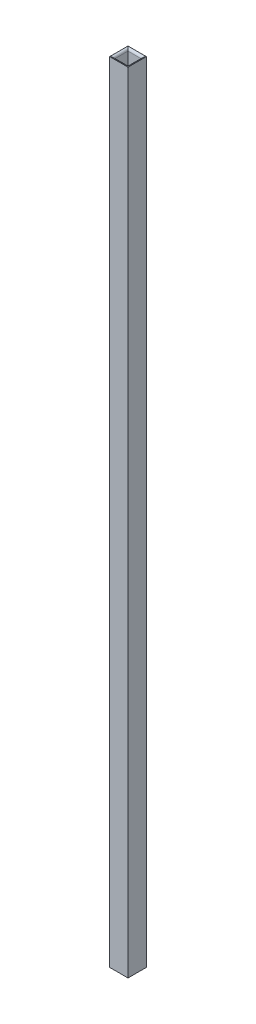
ISO-10303-21;
HEADER;
FILE_DESCRIPTION(('STEP AP214'),'2;1');
FILE_NAME('part.step','',(''),(''),'','','');
FILE_SCHEMA(('AUTOMOTIVE_DESIGN { 1 0 10303 214 1 1 1 1 }'));
ENDSEC;
DATA;
#1=APPLICATION_CONTEXT('core data for automotive mechanical design processes');
#2=APPLICATION_PROTOCOL_DEFINITION('international standard','automotive_design',2000,#1);
#3=PRODUCT_CONTEXT('',#1,'mechanical');
#4=PRODUCT('Part','Part','',(#3));
#5=PRODUCT_RELATED_PRODUCT_CATEGORY('part','',(#4));
#6=PRODUCT_DEFINITION_FORMATION('','',#4);
#7=PRODUCT_DEFINITION_CONTEXT('part definition',#1,'design');
#8=PRODUCT_DEFINITION('design','',#6,#7);
#9=PRODUCT_DEFINITION_SHAPE('','',#8);
#10=(LENGTH_UNIT() NAMED_UNIT(*) SI_UNIT(.MILLI.,.METRE.));
#11=(NAMED_UNIT(*) PLANE_ANGLE_UNIT() SI_UNIT($,.RADIAN.));
#12=(NAMED_UNIT(*) SI_UNIT($,.STERADIAN.) SOLID_ANGLE_UNIT());
#13=UNCERTAINTY_MEASURE_WITH_UNIT(LENGTH_MEASURE(1.E-05),#10,'distance_accuracy_value','');
#14=(GEOMETRIC_REPRESENTATION_CONTEXT(3) GLOBAL_UNCERTAINTY_ASSIGNED_CONTEXT((#13)) GLOBAL_UNIT_ASSIGNED_CONTEXT((#10,
#11,#12)) REPRESENTATION_CONTEXT('',''));
#15=CARTESIAN_POINT('',(0.,0.,0.));
#16=DIRECTION('',(0.,0.,1.));
#17=DIRECTION('',(1.,0.,0.));
#18=AXIS2_PLACEMENT_3D('',#15,#16,#17);
#19=CARTESIAN_POINT('',(-15.5448,557.276,-16.7767));
#20=DIRECTION('',(-1.,0.,0.));
#21=DIRECTION('',(0.,0.,1.));
#22=AXIS2_PLACEMENT_3D('',#19,#20,#21);
#23=CYLINDRICAL_SURFACE('',#22,1.524);
#24=CARTESIAN_POINT('',(-15.4813,557.276,-16.7767));
#25=DIRECTION('',(-0.707106781186547,0.,0.707106781186547));
#26=DIRECTION('',(-0.707106781186547,0.,-0.707106781186547));
#27=AXIS2_PLACEMENT_3D('',#24,#25,#26);
#28=ELLIPSE('',#27,2.1552614690566,1.524);
#29=CARTESIAN_POINT('',(-13.9573,557.276,-15.2527));
#30=VERTEX_POINT('',#29);
#31=CARTESIAN_POINT('',(-15.4813,558.8,-16.7767));
#32=VERTEX_POINT('',#31);
#33=EDGE_CURVE('E11',#30,#32,#28,.T.);
#34=ORIENTED_EDGE('',*,*,#33,.F.);
#35=DIRECTION('',(-1.,0.,0.));
#36=VECTOR('',#35,1.);
#37=CARTESIAN_POINT('',(-15.5448,557.276,-15.2527));
#38=LINE('',#37,#36);
#39=CARTESIAN_POINT('',(-4.13230000000001,557.276,-15.2527));
#40=VERTEX_POINT('',#39);
#41=EDGE_CURVE('E239',#40,#30,#38,.T.);
#42=ORIENTED_EDGE('',*,*,#41,.F.);
#43=CARTESIAN_POINT('',(-2.60830000000001,557.276,-16.7767));
#44=DIRECTION('',(-0.707106781186547,0.,-0.707106781186547));
#45=DIRECTION('',(0.707106781186547,0.,-0.707106781186547));
#46=AXIS2_PLACEMENT_3D('',#43,#44,#45);
#47=ELLIPSE('',#46,2.1552614690566,1.524);
#48=CARTESIAN_POINT('',(-2.60830000000001,558.8,-16.7767));
#49=VERTEX_POINT('',#48);
#50=EDGE_CURVE('E53',#40,#49,#47,.T.);
#51=ORIENTED_EDGE('',*,*,#50,.T.);
#52=DIRECTION('',(-1.,0.,0.));
#53=VECTOR('',#52,1.);
#54=CARTESIAN_POINT('',(0.,558.8,-16.7767));
#55=LINE('',#54,#53);
#56=EDGE_CURVE('E215',#32,#49,#55,.F.);
#57=ORIENTED_EDGE('',*,*,#56,.F.);
#58=EDGE_LOOP('',(#34,#42,#51,#57));
#59=FACE_BOUND('',#58,.T.);
#60=ADVANCED_FACE('F45',(#59),#23,.T.);
#61=CARTESIAN_POINT('',(-2.60830000000001,557.276,-16.8402));
#62=DIRECTION('',(0.,0.,-1.));
#63=DIRECTION('',(-1.,0.,0.));
#64=AXIS2_PLACEMENT_3D('',#61,#62,#63);
#65=CYLINDRICAL_SURFACE('',#64,1.524);
#66=ORIENTED_EDGE('',*,*,#50,.F.);
#67=DIRECTION('',(0.,0.,-1.));
#68=VECTOR('',#67,1.);
#69=CARTESIAN_POINT('',(-4.13230000000001,557.276,-16.8402));
#70=LINE('',#69,#68);
#71=CARTESIAN_POINT('',(-4.13230000000001,557.276,-5.42770000000001));
#72=VERTEX_POINT('',#71);
#73=EDGE_CURVE('E235',#72,#40,#70,.T.);
#74=ORIENTED_EDGE('',*,*,#73,.F.);
#75=CARTESIAN_POINT('',(-2.60830000000001,557.276,-3.90370000000001));
#76=DIRECTION('',(0.707106781186547,0.,-0.707106781186548));
#77=DIRECTION('',(0.707106781186548,0.,0.707106781186547));
#78=AXIS2_PLACEMENT_3D('',#75,#76,#77);
#79=ELLIPSE('',#78,2.1552614690566,1.524);
#80=CARTESIAN_POINT('',(-2.60830000000001,558.8,-3.90370000000001));
#81=VERTEX_POINT('',#80);
#82=EDGE_CURVE('E67',#72,#81,#79,.T.);
#83=ORIENTED_EDGE('',*,*,#82,.T.);
#84=DIRECTION('',(0.,0.,-1.));
#85=VECTOR('',#84,1.);
#86=CARTESIAN_POINT('',(-2.60830000000001,558.8,0.));
#87=LINE('',#86,#85);
#88=EDGE_CURVE('E219',#49,#81,#87,.F.);
#89=ORIENTED_EDGE('',*,*,#88,.F.);
#90=EDGE_LOOP('',(#66,#74,#83,#89));
#91=FACE_BOUND('',#90,.T.);
#92=ADVANCED_FACE('F250',(#91),#65,.T.);
#93=CARTESIAN_POINT('',(-15.5448,557.276,-3.90370000000001));
#94=DIRECTION('',(1.,0.,0.));
#95=DIRECTION('',(0.,0.,-1.));
#96=AXIS2_PLACEMENT_3D('',#93,#94,#95);
#97=CYLINDRICAL_SURFACE('',#96,1.524);
#98=ORIENTED_EDGE('',*,*,#82,.F.);
#99=DIRECTION('',(1.,0.,0.));
#100=VECTOR('',#99,1.);
#101=CARTESIAN_POINT('',(-15.5448,557.276,-5.42770000000001));
#102=LINE('',#101,#100);
#103=CARTESIAN_POINT('',(-13.9573,557.276,-5.42770000000001));
#104=VERTEX_POINT('',#103);
#105=EDGE_CURVE('E231',#104,#72,#102,.T.);
#106=ORIENTED_EDGE('',*,*,#105,.F.);
#107=CARTESIAN_POINT('',(-15.4813,557.276,-3.90370000000001));
#108=DIRECTION('',(0.707106781186548,0.,0.707106781186547));
#109=DIRECTION('',(-0.707106781186547,0.,0.707106781186548));
#110=AXIS2_PLACEMENT_3D('',#107,#108,#109);
#111=ELLIPSE('',#110,2.1552614690566,1.524);
#112=CARTESIAN_POINT('',(-15.4813,558.8,-3.90370000000001));
#113=VERTEX_POINT('',#112);
#114=EDGE_CURVE('E243',#104,#113,#111,.T.);
#115=ORIENTED_EDGE('',*,*,#114,.T.);
#116=DIRECTION('',(1.,0.,0.));
#117=VECTOR('',#116,1.);
#118=CARTESIAN_POINT('',(0.,558.8,-3.90370000000001));
#119=LINE('',#118,#117);
#120=EDGE_CURVE('E223',#81,#113,#119,.F.);
#121=ORIENTED_EDGE('',*,*,#120,.F.);
#122=EDGE_LOOP('',(#98,#106,#115,#121));
#123=FACE_BOUND('',#122,.T.);
#124=ADVANCED_FACE('F315',(#123),#97,.T.);
#125=CARTESIAN_POINT('',(-15.4813,557.276,-16.8402));
#126=DIRECTION('',(0.,0.,1.));
#127=DIRECTION('',(1.,0.,0.));
#128=AXIS2_PLACEMENT_3D('',#125,#126,#127);
#129=CYLINDRICAL_SURFACE('',#128,1.524);
#130=DIRECTION('',(0.,0.,1.));
#131=VECTOR('',#130,1.);
#132=CARTESIAN_POINT('',(-13.9573,557.276,-16.8402));
#133=LINE('',#132,#131);
#134=EDGE_CURVE('E211',#30,#104,#133,.T.);
#135=ORIENTED_EDGE('',*,*,#134,.F.);
#136=ORIENTED_EDGE('',*,*,#33,.T.);
#137=DIRECTION('',(0.,0.,1.));
#138=VECTOR('',#137,1.);
#139=CARTESIAN_POINT('',(-15.4813,558.8,0.));
#140=LINE('',#139,#138);
#141=EDGE_CURVE('E227',#113,#32,#140,.F.);
#142=ORIENTED_EDGE('',*,*,#141,.F.);
#143=ORIENTED_EDGE('',*,*,#114,.F.);
#144=EDGE_LOOP('',(#135,#136,#142,#143));
#145=FACE_BOUND('',#144,.T.);
#146=ADVANCED_FACE('F255',(#145),#129,.T.);
#147=CARTESIAN_POINT('',(-15.5448,1.52399999999997,-3.90370000000001));
#148=DIRECTION('',(1.,0.,0.));
#149=DIRECTION('',(0.,0.,-1.));
#150=AXIS2_PLACEMENT_3D('',#147,#148,#149);
#151=CYLINDRICAL_SURFACE('',#150,1.524);
#152=CARTESIAN_POINT('',(-15.4813,1.52399999999997,-3.90370000000001));
#153=DIRECTION('',(0.707106781186548,0.,0.707106781186547));
#154=DIRECTION('',(0.707106781186547,0.,-0.707106781186548));
#155=AXIS2_PLACEMENT_3D('',#152,#153,#154);
#156=ELLIPSE('',#155,2.1552614690566,1.524);
#157=CARTESIAN_POINT('',(-13.9573,1.52400000000008,-5.42770000000001));
#158=VERTEX_POINT('',#157);
#159=CARTESIAN_POINT('',(-15.4813,0.,-3.90370000000001));
#160=VERTEX_POINT('',#159);
#161=EDGE_CURVE('E208',#158,#160,#156,.F.);
#162=ORIENTED_EDGE('',*,*,#161,.F.);
#163=DIRECTION('',(-1.,0.,0.));
#164=VECTOR('',#163,1.);
#165=CARTESIAN_POINT('',(-15.5448,1.52399999999997,-5.42770000000001));
#166=LINE('',#165,#164);
#167=CARTESIAN_POINT('',(-4.13230000000001,1.52400000000008,-5.42770000000001));
#168=VERTEX_POINT('',#167);
#169=EDGE_CURVE('E195',#168,#158,#166,.T.);
#170=ORIENTED_EDGE('',*,*,#169,.F.);
#171=CARTESIAN_POINT('',(-2.60830000000001,1.52399999999997,-3.90370000000001));
#172=DIRECTION('',(0.707106781186547,0.,-0.707106781186548));
#173=DIRECTION('',(-0.707106781186548,0.,-0.707106781186547));
#174=AXIS2_PLACEMENT_3D('',#171,#172,#173);
#175=ELLIPSE('',#174,2.1552614690566,1.524);
#176=CARTESIAN_POINT('',(-2.60830000000001,0.,-3.90370000000001));
#177=VERTEX_POINT('',#176);
#178=EDGE_CURVE('E205',#168,#177,#175,.F.);
#179=ORIENTED_EDGE('',*,*,#178,.T.);
#180=DIRECTION('',(-1.,0.,0.));
#181=VECTOR('',#180,1.);
#182=CARTESIAN_POINT('',(-15.5448,0.,-3.90370000000001));
#183=LINE('',#182,#181);
#184=EDGE_CURVE('E166',#160,#177,#183,.F.);
#185=ORIENTED_EDGE('',*,*,#184,.F.);
#186=EDGE_LOOP('',(#162,#170,#179,#185));
#187=FACE_BOUND('',#186,.T.);
#188=ADVANCED_FACE('F323',(#187),#151,.T.);
#189=CARTESIAN_POINT('',(-2.60830000000001,1.52399999999997,-16.8402));
#190=DIRECTION('',(0.,0.,-1.));
#191=DIRECTION('',(-1.,0.,0.));
#192=AXIS2_PLACEMENT_3D('',#189,#190,#191);
#193=CYLINDRICAL_SURFACE('',#192,1.524);
#194=ORIENTED_EDGE('',*,*,#178,.F.);
#195=DIRECTION('',(0.,0.,1.));
#196=VECTOR('',#195,1.);
#197=CARTESIAN_POINT('',(-4.13230000000001,1.52399999999997,-16.8402));
#198=LINE('',#197,#196);
#199=CARTESIAN_POINT('',(-4.13230000000001,1.52400000000008,-15.2527));
#200=VERTEX_POINT('',#199);
#201=EDGE_CURVE('E191',#200,#168,#198,.T.);
#202=ORIENTED_EDGE('',*,*,#201,.F.);
#203=CARTESIAN_POINT('',(-2.60830000000001,1.52399999999997,-16.7767));
#204=DIRECTION('',(-0.707106781186547,0.,-0.707106781186547));
#205=DIRECTION('',(-0.707106781186547,0.,0.707106781186547));
#206=AXIS2_PLACEMENT_3D('',#203,#204,#205);
#207=ELLIPSE('',#206,2.1552614690566,1.524);
#208=CARTESIAN_POINT('',(-2.60830000000001,0.,-16.7767));
#209=VERTEX_POINT('',#208);
#210=EDGE_CURVE('E202',#200,#209,#207,.F.);
#211=ORIENTED_EDGE('',*,*,#210,.T.);
#212=DIRECTION('',(0.,0.,1.));
#213=VECTOR('',#212,1.);
#214=CARTESIAN_POINT('',(-2.60830000000001,0.,-16.8402));
#215=LINE('',#214,#213);
#216=EDGE_CURVE('E175',#177,#209,#215,.F.);
#217=ORIENTED_EDGE('',*,*,#216,.F.);
#218=EDGE_LOOP('',(#194,#202,#211,#217));
#219=FACE_BOUND('',#218,.T.);
#220=ADVANCED_FACE('F326',(#219),#193,.T.);
#221=CARTESIAN_POINT('',(-15.5448,1.52399999999997,-16.7767));
#222=DIRECTION('',(-1.,0.,0.));
#223=DIRECTION('',(0.,0.,1.));
#224=AXIS2_PLACEMENT_3D('',#221,#222,#223);
#225=CYLINDRICAL_SURFACE('',#224,1.524);
#226=ORIENTED_EDGE('',*,*,#210,.F.);
#227=DIRECTION('',(1.,0.,0.));
#228=VECTOR('',#227,1.);
#229=CARTESIAN_POINT('',(-15.5448,1.52399999999997,-15.2527));
#230=LINE('',#229,#228);
#231=CARTESIAN_POINT('',(-13.9573,1.52400000000008,-15.2527));
#232=VERTEX_POINT('',#231);
#233=EDGE_CURVE('E187',#232,#200,#230,.T.);
#234=ORIENTED_EDGE('',*,*,#233,.F.);
#235=CARTESIAN_POINT('',(-15.4813,1.52399999999997,-16.7767));
#236=DIRECTION('',(-0.707106781186547,0.,0.707106781186547));
#237=DIRECTION('',(0.707106781186547,0.,0.707106781186547));
#238=AXIS2_PLACEMENT_3D('',#235,#236,#237);
#239=ELLIPSE('',#238,2.1552614690566,1.524);
#240=CARTESIAN_POINT('',(-15.4813,0.,-16.7767));
#241=VERTEX_POINT('',#240);
#242=EDGE_CURVE('E199',#232,#241,#239,.F.);
#243=ORIENTED_EDGE('',*,*,#242,.T.);
#244=DIRECTION('',(1.,0.,0.));
#245=VECTOR('',#244,1.);
#246=CARTESIAN_POINT('',(-15.5448,0.,-16.7767));
#247=LINE('',#246,#245);
#248=EDGE_CURVE('E179',#209,#241,#247,.F.);
#249=ORIENTED_EDGE('',*,*,#248,.F.);
#250=EDGE_LOOP('',(#226,#234,#243,#249));
#251=FACE_BOUND('',#250,.T.);
#252=ADVANCED_FACE('F330',(#251),#225,.T.);
#253=CARTESIAN_POINT('',(-15.4813,1.52399999999997,-16.8402));
#254=DIRECTION('',(0.,0.,1.));
#255=DIRECTION('',(1.,0.,0.));
#256=AXIS2_PLACEMENT_3D('',#253,#254,#255);
#257=CYLINDRICAL_SURFACE('',#256,1.524);
#258=DIRECTION('',(0.,0.,-1.));
#259=VECTOR('',#258,1.);
#260=CARTESIAN_POINT('',(-13.9573,1.52399999999997,-16.8402));
#261=LINE('',#260,#259);
#262=EDGE_CURVE('E161',#158,#232,#261,.T.);
#263=ORIENTED_EDGE('',*,*,#262,.F.);
#264=ORIENTED_EDGE('',*,*,#161,.T.);
#265=DIRECTION('',(0.,0.,-1.));
#266=VECTOR('',#265,1.);
#267=CARTESIAN_POINT('',(-15.4813,0.,-16.8402));
#268=LINE('',#267,#266);
#269=EDGE_CURVE('E183',#241,#160,#268,.F.);
#270=ORIENTED_EDGE('',*,*,#269,.F.);
#271=ORIENTED_EDGE('',*,*,#242,.F.);
#272=EDGE_LOOP('',(#263,#264,#270,#271));
#273=FACE_BOUND('',#272,.T.);
#274=ADVANCED_FACE('F334',(#273),#257,.T.);
#275=CARTESIAN_POINT('',(-15.5448,558.8,-16.8402));
#276=DIRECTION('',(1.,0.,0.));
#277=DIRECTION('',(0.,0.,-1.));
#278=AXIS2_PLACEMENT_3D('',#275,#276,#277);
#279=PLANE('',#278);
#280=DIRECTION('',(0.,0.,1.));
#281=VECTOR('',#280,1.);
#282=CARTESIAN_POINT('',(-15.5448,0.,-16.8402));
#283=LINE('',#282,#281);
#284=CARTESIAN_POINT('',(-15.5448,0.,-16.8402));
#285=VERTEX_POINT('',#284);
#286=CARTESIAN_POINT('',(-15.5448,0.,-3.84020000000001));
#287=VERTEX_POINT('',#286);
#288=EDGE_CURVE('E159',#285,#287,#283,.T.);
#289=ORIENTED_EDGE('',*,*,#288,.T.);
#290=DIRECTION('',(0.,-1.,0.));
#291=VECTOR('',#290,1.);
#292=CARTESIAN_POINT('',(-15.5448,558.8,-3.84020000000001));
#293=LINE('',#292,#291);
#294=CARTESIAN_POINT('',(-15.5448,558.8,-3.84020000000001));
#295=VERTEX_POINT('',#294);
#296=EDGE_CURVE('E137',#295,#287,#293,.T.);
#297=ORIENTED_EDGE('',*,*,#296,.F.);
#298=DIRECTION('',(0.,0.,1.));
#299=VECTOR('',#298,1.);
#300=CARTESIAN_POINT('',(-15.5448,558.8,-16.8402));
#301=LINE('',#300,#299);
#302=CARTESIAN_POINT('',(-15.5448,558.8,-16.8402));
#303=VERTEX_POINT('',#302);
#304=EDGE_CURVE('E145',#303,#295,#301,.T.);
#305=ORIENTED_EDGE('',*,*,#304,.F.);
#306=DIRECTION('',(0.,-1.,0.));
#307=VECTOR('',#306,1.);
#308=CARTESIAN_POINT('',(-15.5448,558.8,-16.8402));
#309=LINE('',#308,#307);
#310=EDGE_CURVE('E279',#303,#285,#309,.T.);
#311=ORIENTED_EDGE('',*,*,#310,.T.);
#312=EDGE_LOOP('',(#289,#297,#305,#311));
#313=FACE_BOUND('',#312,.T.);
#314=ADVANCED_FACE('F157',(#313),#279,.F.);
#315=CARTESIAN_POINT('',(-15.5448,558.8,-3.84020000000001));
#316=DIRECTION('',(0.,0.,-1.));
#317=DIRECTION('',(-1.,0.,0.));
#318=AXIS2_PLACEMENT_3D('',#315,#316,#317);
#319=PLANE('',#318);
#320=DIRECTION('',(1.,0.,0.));
#321=VECTOR('',#320,1.);
#322=CARTESIAN_POINT('',(-15.5448,0.,-3.84020000000001));
#323=LINE('',#322,#321);
#324=CARTESIAN_POINT('',(-2.54480000000001,0.,-3.84020000000001));
#325=VERTEX_POINT('',#324);
#326=EDGE_CURVE('E282',#287,#325,#323,.T.);
#327=ORIENTED_EDGE('',*,*,#326,.T.);
#328=DIRECTION('',(0.,-1.,0.));
#329=VECTOR('',#328,1.);
#330=CARTESIAN_POINT('',(-2.54480000000001,558.8,-3.84020000000001));
#331=LINE('',#330,#329);
#332=CARTESIAN_POINT('',(-2.54480000000001,558.8,-3.84020000000001));
#333=VERTEX_POINT('',#332);
#334=EDGE_CURVE('E140',#333,#325,#331,.T.);
#335=ORIENTED_EDGE('',*,*,#334,.F.);
#336=DIRECTION('',(1.,0.,0.));
#337=VECTOR('',#336,1.);
#338=CARTESIAN_POINT('',(-15.5448,558.8,-3.84020000000001));
#339=LINE('',#338,#337);
#340=EDGE_CURVE('E133',#295,#333,#339,.T.);
#341=ORIENTED_EDGE('',*,*,#340,.F.);
#342=ORIENTED_EDGE('',*,*,#296,.T.);
#343=EDGE_LOOP('',(#327,#335,#341,#342));
#344=FACE_BOUND('',#343,.T.);
#345=ADVANCED_FACE('F135',(#344),#319,.F.);
#346=CARTESIAN_POINT('',(-2.54480000000001,558.8,-16.8402));
#347=DIRECTION('',(-1.,0.,0.));
#348=DIRECTION('',(0.,0.,1.));
#349=AXIS2_PLACEMENT_3D('',#346,#347,#348);
#350=PLANE('',#349);
#351=DIRECTION('',(0.,0.,-1.));
#352=VECTOR('',#351,1.);
#353=CARTESIAN_POINT('',(-2.54480000000001,0.,-16.8402));
#354=LINE('',#353,#352);
#355=CARTESIAN_POINT('',(-2.54480000000001,0.,-16.8402));
#356=VERTEX_POINT('',#355);
#357=EDGE_CURVE('E285',#325,#356,#354,.T.);
#358=ORIENTED_EDGE('',*,*,#357,.T.);
#359=DIRECTION('',(0.,-1.,0.));
#360=VECTOR('',#359,1.);
#361=CARTESIAN_POINT('',(-2.54480000000001,558.8,-16.8402));
#362=LINE('',#361,#360);
#363=CARTESIAN_POINT('',(-2.54480000000001,558.8,-16.8402));
#364=VERTEX_POINT('',#363);
#365=EDGE_CURVE('E168',#364,#356,#362,.T.);
#366=ORIENTED_EDGE('',*,*,#365,.F.);
#367=DIRECTION('',(0.,0.,-1.));
#368=VECTOR('',#367,1.);
#369=CARTESIAN_POINT('',(-2.54480000000001,558.8,-16.8402));
#370=LINE('',#369,#368);
#371=EDGE_CURVE('E144',#333,#364,#370,.T.);
#372=ORIENTED_EDGE('',*,*,#371,.F.);
#373=ORIENTED_EDGE('',*,*,#334,.T.);
#374=EDGE_LOOP('',(#358,#366,#372,#373));
#375=FACE_BOUND('',#374,.T.);
#376=ADVANCED_FACE('F301',(#375),#350,.F.);
#377=CARTESIAN_POINT('',(-15.5448,558.8,-16.8402));
#378=DIRECTION('',(0.,0.,1.));
#379=DIRECTION('',(1.,0.,0.));
#380=AXIS2_PLACEMENT_3D('',#377,#378,#379);
#381=PLANE('',#380);
#382=DIRECTION('',(-1.,0.,0.));
#383=VECTOR('',#382,1.);
#384=CARTESIAN_POINT('',(-15.5448,0.,-16.8402));
#385=LINE('',#384,#383);
#386=EDGE_CURVE('E155',#356,#285,#385,.T.);
#387=ORIENTED_EDGE('',*,*,#386,.T.);
#388=ORIENTED_EDGE('',*,*,#310,.F.);
#389=DIRECTION('',(-1.,0.,0.));
#390=VECTOR('',#389,1.);
#391=CARTESIAN_POINT('',(-15.5448,558.8,-16.8402));
#392=LINE('',#391,#390);
#393=EDGE_CURVE('E150',#364,#303,#392,.T.);
#394=ORIENTED_EDGE('',*,*,#393,.F.);
#395=ORIENTED_EDGE('',*,*,#365,.T.);
#396=EDGE_LOOP('',(#387,#388,#394,#395));
#397=FACE_BOUND('',#396,.T.);
#398=ADVANCED_FACE('F296',(#397),#381,.F.);
#399=CARTESIAN_POINT('',(0.,558.8,0.));
#400=DIRECTION('',(0.,1.,0.));
#401=DIRECTION('',(0.,0.,1.));
#402=AXIS2_PLACEMENT_3D('',#399,#400,#401);
#403=PLANE('',#402);
#404=ORIENTED_EDGE('',*,*,#120,.T.);
#405=ORIENTED_EDGE('',*,*,#141,.T.);
#406=ORIENTED_EDGE('',*,*,#56,.T.);
#407=ORIENTED_EDGE('',*,*,#88,.T.);
#408=EDGE_LOOP('',(#404,#405,#406,#407));
#409=FACE_BOUND('',#408,.T.);
#410=ORIENTED_EDGE('',*,*,#304,.T.);
#411=ORIENTED_EDGE('',*,*,#340,.T.);
#412=ORIENTED_EDGE('',*,*,#371,.T.);
#413=ORIENTED_EDGE('',*,*,#393,.T.);
#414=EDGE_LOOP('',(#410,#411,#412,#413));
#415=FACE_BOUND('',#414,.T.);
#416=ADVANCED_FACE('F148',(#409,#415),#403,.T.);
#417=CARTESIAN_POINT('',(0.,0.,0.));
#418=DIRECTION('',(0.,1.,0.));
#419=DIRECTION('',(0.,0.,1.));
#420=AXIS2_PLACEMENT_3D('',#417,#418,#419);
#421=PLANE('',#420);
#422=ORIENTED_EDGE('',*,*,#248,.T.);
#423=ORIENTED_EDGE('',*,*,#269,.T.);
#424=ORIENTED_EDGE('',*,*,#184,.T.);
#425=ORIENTED_EDGE('',*,*,#216,.T.);
#426=EDGE_LOOP('',(#422,#423,#424,#425));
#427=FACE_BOUND('',#426,.T.);
#428=ORIENTED_EDGE('',*,*,#288,.F.);
#429=ORIENTED_EDGE('',*,*,#386,.F.);
#430=ORIENTED_EDGE('',*,*,#357,.F.);
#431=ORIENTED_EDGE('',*,*,#326,.F.);
#432=EDGE_LOOP('',(#428,#429,#430,#431));
#433=FACE_BOUND('',#432,.T.);
#434=ADVANCED_FACE('F300',(#427,#433),#421,.F.);
#435=CARTESIAN_POINT('',(-13.9573,558.8,-16.8402));
#436=DIRECTION('',(1.,0.,0.));
#437=DIRECTION('',(0.,0.,-1.));
#438=AXIS2_PLACEMENT_3D('',#435,#436,#437);
#439=PLANE('',#438);
#440=DIRECTION('',(0.,-1.,0.));
#441=VECTOR('',#440,1.);
#442=CARTESIAN_POINT('',(-13.9573,558.8,-15.2527));
#443=LINE('',#442,#441);
#444=EDGE_CURVE('E260',#30,#232,#443,.T.);
#445=ORIENTED_EDGE('',*,*,#444,.F.);
#446=ORIENTED_EDGE('',*,*,#134,.T.);
#447=DIRECTION('',(0.,-1.,0.));
#448=VECTOR('',#447,1.);
#449=CARTESIAN_POINT('',(-13.9573,558.8,-5.42770000000001));
#450=LINE('',#449,#448);
#451=EDGE_CURVE('E271',#104,#158,#450,.T.);
#452=ORIENTED_EDGE('',*,*,#451,.T.);
#453=ORIENTED_EDGE('',*,*,#262,.T.);
#454=EDGE_LOOP('',(#445,#446,#452,#453));
#455=FACE_BOUND('',#454,.T.);
#456=ADVANCED_FACE('F375',(#455),#439,.T.);
#457=CARTESIAN_POINT('',(-15.5448,558.8,-5.42770000000001));
#458=DIRECTION('',(0.,0.,-1.));
#459=DIRECTION('',(-1.,0.,0.));
#460=AXIS2_PLACEMENT_3D('',#457,#458,#459);
#461=PLANE('',#460);
#462=ORIENTED_EDGE('',*,*,#451,.F.);
#463=ORIENTED_EDGE('',*,*,#105,.T.);
#464=DIRECTION('',(0.,-1.,0.));
#465=VECTOR('',#464,1.);
#466=CARTESIAN_POINT('',(-4.13230000000001,558.8,-5.42770000000001));
#467=LINE('',#466,#465);
#468=EDGE_CURVE('E267',#72,#168,#467,.T.);
#469=ORIENTED_EDGE('',*,*,#468,.T.);
#470=ORIENTED_EDGE('',*,*,#169,.T.);
#471=EDGE_LOOP('',(#462,#463,#469,#470));
#472=FACE_BOUND('',#471,.T.);
#473=ADVANCED_FACE('F384',(#472),#461,.T.);
#474=CARTESIAN_POINT('',(-4.13230000000001,558.8,-16.8402));
#475=DIRECTION('',(-1.,0.,0.));
#476=DIRECTION('',(0.,0.,1.));
#477=AXIS2_PLACEMENT_3D('',#474,#475,#476);
#478=PLANE('',#477);
#479=ORIENTED_EDGE('',*,*,#468,.F.);
#480=ORIENTED_EDGE('',*,*,#73,.T.);
#481=DIRECTION('',(0.,-1.,0.));
#482=VECTOR('',#481,1.);
#483=CARTESIAN_POINT('',(-4.13230000000001,558.8,-15.2527));
#484=LINE('',#483,#482);
#485=EDGE_CURVE('E262',#40,#200,#484,.T.);
#486=ORIENTED_EDGE('',*,*,#485,.T.);
#487=ORIENTED_EDGE('',*,*,#201,.T.);
#488=EDGE_LOOP('',(#479,#480,#486,#487));
#489=FACE_BOUND('',#488,.T.);
#490=ADVANCED_FACE('F394',(#489),#478,.T.);
#491=CARTESIAN_POINT('',(-15.5448,558.8,-15.2527));
#492=DIRECTION('',(0.,0.,1.));
#493=DIRECTION('',(1.,0.,0.));
#494=AXIS2_PLACEMENT_3D('',#491,#492,#493);
#495=PLANE('',#494);
#496=ORIENTED_EDGE('',*,*,#485,.F.);
#497=ORIENTED_EDGE('',*,*,#41,.T.);
#498=ORIENTED_EDGE('',*,*,#444,.T.);
#499=ORIENTED_EDGE('',*,*,#233,.T.);
#500=EDGE_LOOP('',(#496,#497,#498,#499));
#501=FACE_BOUND('',#500,.T.);
#502=ADVANCED_FACE('F259',(#501),#495,.T.);
#503=CLOSED_SHELL('',(#60,#92,#124,#146,#188,#220,#252,#274,#314,#345,#376,#398,#416,#434,#456,
#473,#490,#502));
#504=MANIFOLD_SOLID_BREP('B2',#503);
#505=ADVANCED_BREP_SHAPE_REPRESENTATION('',(#18,#504),#14);
#506=SHAPE_DEFINITION_REPRESENTATION(#9,#505);
ENDSEC;
END-ISO-10303-21;
